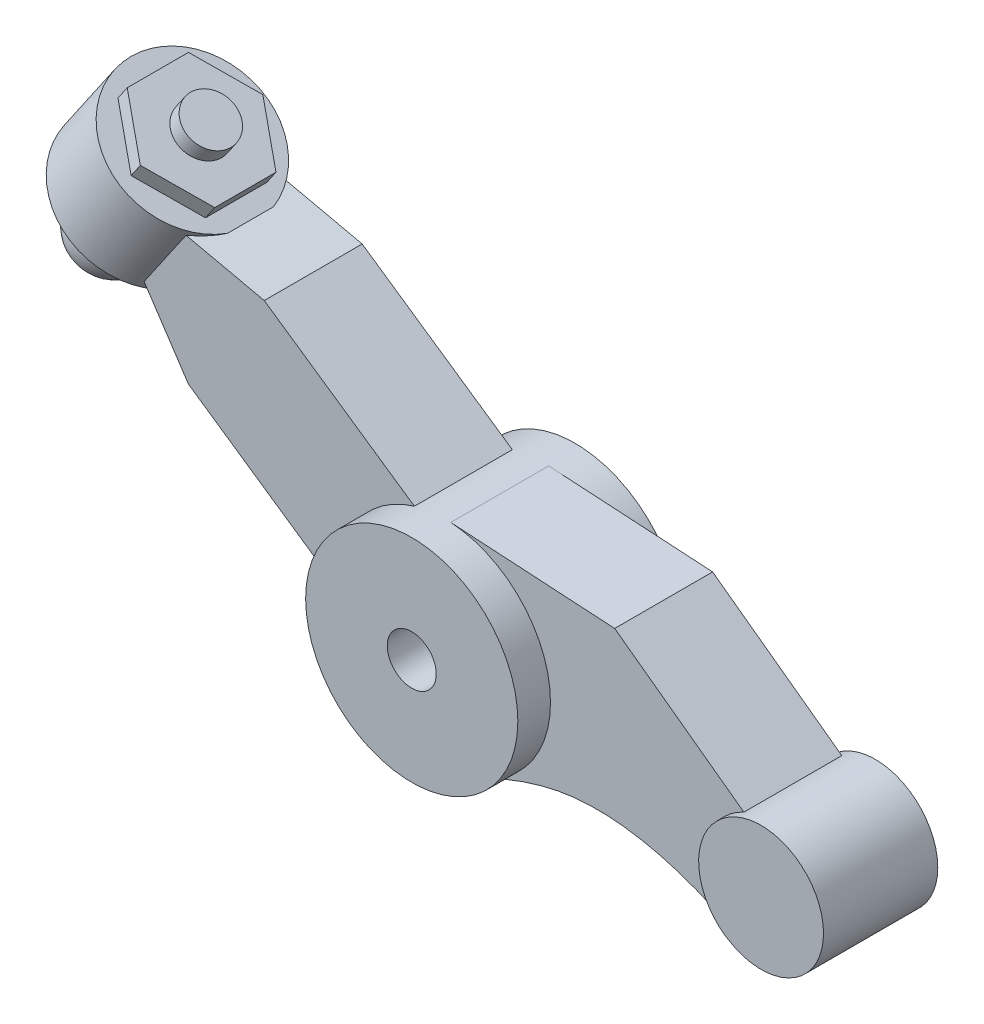
ISO-10303-21;
HEADER;
FILE_DESCRIPTION(('STEP AP214'),'2;1');
FILE_NAME('part.step','',(''),(''),'','','');
FILE_SCHEMA(('AUTOMOTIVE_DESIGN { 1 0 10303 214 1 1 1 1 }'));
ENDSEC;
DATA;
#1=APPLICATION_CONTEXT('core data for automotive mechanical design processes');
#2=APPLICATION_PROTOCOL_DEFINITION('international standard','automotive_design',2000,#1);
#3=PRODUCT_CONTEXT('',#1,'mechanical');
#4=PRODUCT('Part','Part','',(#3));
#5=PRODUCT_RELATED_PRODUCT_CATEGORY('part','',(#4));
#6=PRODUCT_DEFINITION_FORMATION('','',#4);
#7=PRODUCT_DEFINITION_CONTEXT('part definition',#1,'design');
#8=PRODUCT_DEFINITION('design','',#6,#7);
#9=PRODUCT_DEFINITION_SHAPE('','',#8);
#10=(LENGTH_UNIT() NAMED_UNIT(*) SI_UNIT(.MILLI.,.METRE.));
#11=(NAMED_UNIT(*) PLANE_ANGLE_UNIT() SI_UNIT($,.RADIAN.));
#12=(NAMED_UNIT(*) SI_UNIT($,.STERADIAN.) SOLID_ANGLE_UNIT());
#13=UNCERTAINTY_MEASURE_WITH_UNIT(LENGTH_MEASURE(1.E-05),#10,'distance_accuracy_value','');
#14=(GEOMETRIC_REPRESENTATION_CONTEXT(3) GLOBAL_UNCERTAINTY_ASSIGNED_CONTEXT((#13)) GLOBAL_UNIT_ASSIGNED_CONTEXT((#10,
#11,#12)) REPRESENTATION_CONTEXT('',''));
#15=CARTESIAN_POINT('',(0.,0.,0.));
#16=DIRECTION('',(0.,0.,1.));
#17=DIRECTION('',(1.,0.,0.));
#18=AXIS2_PLACEMENT_3D('',#15,#16,#17);
#19=CARTESIAN_POINT('',(3.97757068991306,-1.80597908772505,0.6));
#20=CARTESIAN_POINT('',(3.3360099674459,-1.42892137355787,0.6));
#21=CARTESIAN_POINT('',(2.18413130724052,-1.08683612083201,0.6));
#22=CARTESIAN_POINT('',(1.13775478577054,-1.478027448825,0.6));
#23=CARTESIAN_POINT('',(0.834921808302828,-1.61584534389586,0.6));
#24=CARTESIAN_POINT('',(0.826282358133006,-1.61959801900891,0.6));
#25=B_SPLINE_CURVE_WITH_KNOTS('',3,(#19,#20,#21,#22,#23,#24),.UNSPECIFIED.,.F.,.F.,(4,1,1,4),
(0.,0.696300419657063,0.991396998333315,1.),.UNSPECIFIED.);
#26=DIRECTION('',(0.,0.,-1.));
#27=VECTOR('',#26,1.);
#28=SURFACE_OF_LINEAR_EXTRUSION('',#25,#27);
#29=CARTESIAN_POINT('',(3.97757068991306,-1.80597908772505,-0.6));
#30=CARTESIAN_POINT('',(3.3360099674459,-1.42892137355787,-0.6));
#31=CARTESIAN_POINT('',(2.18413130724052,-1.08683612083201,-0.6));
#32=CARTESIAN_POINT('',(1.13775478577054,-1.478027448825,-0.6));
#33=CARTESIAN_POINT('',(0.834921808302828,-1.61584534389586,-0.6));
#34=CARTESIAN_POINT('',(0.826282358133006,-1.61959801900891,-0.6));
#35=B_SPLINE_CURVE_WITH_KNOTS('',3,(#29,#30,#31,#32,#33,#34),.UNSPECIFIED.,.F.,.F.,(4,1,1,4),
(0.,0.696300419657063,0.991396998333315,1.),.UNSPECIFIED.);
#36=CARTESIAN_POINT('',(3.85078788085251,-1.73445498969905,-0.6));
#37=VERTEX_POINT('',#36);
#38=CARTESIAN_POINT('',(0.826282358133006,-1.61959801900891,-0.6));
#39=VERTEX_POINT('',#38);
#40=EDGE_CURVE('E128',#37,#39,#35,.T.);
#41=ORIENTED_EDGE('',*,*,#40,.F.);
#42=DIRECTION('',(0.,0.,-1.));
#43=VECTOR('',#42,1.);
#44=CARTESIAN_POINT('',(3.85078788085251,-1.73445498969905,0.6));
#45=LINE('',#44,#43);
#46=CARTESIAN_POINT('',(3.85078788085251,-1.73445498969905,0.6));
#47=VERTEX_POINT('',#46);
#48=EDGE_CURVE('E12',#47,#37,#45,.T.);
#49=ORIENTED_EDGE('',*,*,#48,.F.);
#50=CARTESIAN_POINT('',(0.826282358133006,-1.61959801900891,0.6));
#51=VERTEX_POINT('',#50);
#52=EDGE_CURVE('E144',#47,#51,#25,.T.);
#53=ORIENTED_EDGE('',*,*,#52,.T.);
#54=DIRECTION('',(0.,0.,-1.));
#55=VECTOR('',#54,1.);
#56=CARTESIAN_POINT('',(0.826282358133006,-1.61959801900891,0.6));
#57=LINE('',#56,#55);
#58=EDGE_CURVE('E71',#51,#39,#57,.T.);
#59=ORIENTED_EDGE('',*,*,#58,.T.);
#60=EDGE_LOOP('',(#41,#49,#53,#59));
#61=FACE_BOUND('',#60,.T.);
#62=ADVANCED_FACE('F54',(#61),#28,.T.);
#63=CARTESIAN_POINT('',(4.28835718655287,-1.10695351343871,0.6));
#64=DIRECTION('',(0.,0.,-1.));
#65=DIRECTION('',(-1.,0.,0.));
#66=AXIS2_PLACEMENT_3D('',#63,#64,#65);
#67=CYLINDRICAL_SURFACE('',#66,0.765);
#68=CARTESIAN_POINT('',(4.28835718655287,-1.10695351343871,-0.6));
#69=DIRECTION('',(0.,0.,1.));
#70=DIRECTION('',(1.,0.,0.));
#71=AXIS2_PLACEMENT_3D('',#68,#69,#70);
#72=CIRCLE('',#71,0.765);
#73=CARTESIAN_POINT('',(3.97757068991306,-0.40792793915236,-0.6));
#74=VERTEX_POINT('',#73);
#75=EDGE_CURVE('E132',#74,#37,#72,.T.);
#76=ORIENTED_EDGE('',*,*,#75,.F.);
#77=DIRECTION('',(0.,0.,-1.));
#78=VECTOR('',#77,1.);
#79=CARTESIAN_POINT('',(3.97757068991306,-0.40792793915236,0.6));
#80=LINE('',#79,#78);
#81=CARTESIAN_POINT('',(3.97757068991306,-0.40792793915236,0.6));
#82=VERTEX_POINT('',#81);
#83=EDGE_CURVE('E63',#82,#74,#80,.T.);
#84=ORIENTED_EDGE('',*,*,#83,.F.);
#85=CARTESIAN_POINT('',(4.28835718655287,-1.10695351343871,0.6));
#86=DIRECTION('',(0.,0.,1.));
#87=DIRECTION('',(1.,0.,0.));
#88=AXIS2_PLACEMENT_3D('',#85,#86,#87);
#89=CIRCLE('',#88,0.765);
#90=EDGE_CURVE('E111',#82,#47,#89,.T.);
#91=ORIENTED_EDGE('',*,*,#90,.T.);
#92=ORIENTED_EDGE('',*,*,#48,.T.);
#93=EDGE_LOOP('',(#76,#84,#91,#92));
#94=FACE_BOUND('',#93,.T.);
#95=ADVANCED_FACE('F150',(#94),#67,.F.);
#96=CARTESIAN_POINT('',(1.19203166574045,1.62962595836703,0.6));
#97=DIRECTION('',(-0.590388192658637,-0.807119434761218,0.));
#98=DIRECTION('',(0.807119434761219,-0.590388192658637,0.));
#99=AXIS2_PLACEMENT_3D('',#96,#97,#98);
#100=PLANE('',#99);
#101=DIRECTION('',(-0.807119434761218,0.590388192658637,0.));
#102=VECTOR('',#101,1.);
#103=CARTESIAN_POINT('',(1.19203166574045,1.62962595836703,-0.6));
#104=LINE('',#103,#102);
#105=CARTESIAN_POINT('',(2.3946417351562,0.749946006705987,-0.6));
#106=VERTEX_POINT('',#105);
#107=EDGE_CURVE('E118',#74,#106,#104,.T.);
#108=ORIENTED_EDGE('',*,*,#107,.T.);
#109=DIRECTION('',(0.,0.,-1.));
#110=VECTOR('',#109,1.);
#111=CARTESIAN_POINT('',(2.3946417351562,0.749946006705987,0.6));
#112=LINE('',#111,#110);
#113=CARTESIAN_POINT('',(2.3946417351562,0.749946006705987,0.6));
#114=VERTEX_POINT('',#113);
#115=EDGE_CURVE('E115',#114,#106,#112,.T.);
#116=ORIENTED_EDGE('',*,*,#115,.F.);
#117=DIRECTION('',(-0.807119434761218,0.590388192658637,0.));
#118=VECTOR('',#117,1.);
#119=CARTESIAN_POINT('',(1.19203166574045,1.62962595836703,0.6));
#120=LINE('',#119,#118);
#121=EDGE_CURVE('E104',#82,#114,#120,.T.);
#122=ORIENTED_EDGE('',*,*,#121,.F.);
#123=ORIENTED_EDGE('',*,*,#83,.T.);
#124=EDGE_LOOP('',(#108,#116,#122,#123));
#125=FACE_BOUND('',#124,.T.);
#126=ADVANCED_FACE('F116',(#125),#100,.F.);
#127=CARTESIAN_POINT('',(0.053419954267125,0.890407493572512,0.6));
#128=DIRECTION('',(-0.0598872692257837,-0.998205146743232,0.));
#129=DIRECTION('',(0.998205146743233,-0.0598872692257837,0.));
#130=AXIS2_PLACEMENT_3D('',#127,#128,#129);
#131=PLANE('',#130);
#132=DIRECTION('',(-0.998205146743233,0.0598872692257837,0.));
#133=VECTOR('',#132,1.);
#134=CARTESIAN_POINT('',(0.053419954267125,0.890407493572512,-0.6));
#135=LINE('',#134,#133);
#136=CARTESIAN_POINT('',(0.386210636546387,0.870441732776233,-0.6));
#137=VERTEX_POINT('',#136);
#138=EDGE_CURVE('E139',#106,#137,#135,.T.);
#139=ORIENTED_EDGE('',*,*,#138,.T.);
#140=DIRECTION('',(0.,0.,-1.));
#141=VECTOR('',#140,1.);
#142=CARTESIAN_POINT('',(0.386210636546387,0.870441732776233,0.6));
#143=LINE('',#142,#141);
#144=CARTESIAN_POINT('',(0.386210636546387,0.870441732776233,0.6));
#145=VERTEX_POINT('',#144);
#146=EDGE_CURVE('E88',#145,#137,#143,.T.);
#147=ORIENTED_EDGE('',*,*,#146,.F.);
#148=DIRECTION('',(-0.998205146743233,0.0598872692257837,0.));
#149=VECTOR('',#148,1.);
#150=CARTESIAN_POINT('',(0.053419954267125,0.890407493572512,0.6));
#151=LINE('',#150,#149);
#152=EDGE_CURVE('E109',#114,#145,#151,.T.);
#153=ORIENTED_EDGE('',*,*,#152,.F.);
#154=ORIENTED_EDGE('',*,*,#115,.T.);
#155=EDGE_LOOP('',(#139,#147,#153,#154));
#156=FACE_BOUND('',#155,.T.);
#157=ADVANCED_FACE('F122',(#156),#131,.F.);
#158=CARTESIAN_POINT('',(0.308357186552869,-0.427224957989969,0.6));
#159=DIRECTION('',(0.,0.,-1.));
#160=DIRECTION('',(-1.,0.,0.));
#161=AXIS2_PLACEMENT_3D('',#158,#159,#160);
#162=CYLINDRICAL_SURFACE('',#161,1.3);
#163=CARTESIAN_POINT('',(0.308357186552869,-0.427224957989969,-0.6));
#164=DIRECTION('',(0.,0.,1.));
#165=DIRECTION('',(1.,0.,0.));
#166=AXIS2_PLACEMENT_3D('',#163,#164,#165);
#167=CIRCLE('',#166,1.3);
#168=EDGE_CURVE('E141',#39,#137,#167,.T.);
#169=ORIENTED_EDGE('',*,*,#168,.F.);
#170=ORIENTED_EDGE('',*,*,#58,.F.);
#171=CARTESIAN_POINT('',(0.308357186552869,-0.427224957989969,0.6));
#172=DIRECTION('',(0.,0.,1.));
#173=DIRECTION('',(1.,0.,0.));
#174=AXIS2_PLACEMENT_3D('',#171,#172,#173);
#175=CIRCLE('',#174,1.3);
#176=EDGE_CURVE('E123',#51,#145,#175,.T.);
#177=ORIENTED_EDGE('',*,*,#176,.T.);
#178=ORIENTED_EDGE('',*,*,#146,.T.);
#179=EDGE_LOOP('',(#169,#170,#177,#178));
#180=FACE_BOUND('',#179,.T.);
#181=ADVANCED_FACE('F151',(#180),#162,.F.);
#182=CARTESIAN_POINT('',(0.,0.,0.6));
#183=DIRECTION('',(0.,0.,1.));
#184=DIRECTION('',(1.,0.,0.));
#185=AXIS2_PLACEMENT_3D('',#182,#183,#184);
#186=PLANE('',#185);
#187=ORIENTED_EDGE('',*,*,#52,.F.);
#188=ORIENTED_EDGE('',*,*,#90,.F.);
#189=ORIENTED_EDGE('',*,*,#121,.T.);
#190=ORIENTED_EDGE('',*,*,#152,.T.);
#191=ORIENTED_EDGE('',*,*,#176,.F.);
#192=EDGE_LOOP('',(#187,#188,#189,#190,#191));
#193=FACE_BOUND('',#192,.T.);
#194=ADVANCED_FACE('F106',(#193),#186,.T.);
#195=CARTESIAN_POINT('',(0.,0.,-0.6));
#196=DIRECTION('',(0.,0.,1.));
#197=DIRECTION('',(1.,0.,0.));
#198=AXIS2_PLACEMENT_3D('',#195,#196,#197);
#199=PLANE('',#198);
#200=ORIENTED_EDGE('',*,*,#40,.T.);
#201=ORIENTED_EDGE('',*,*,#168,.T.);
#202=ORIENTED_EDGE('',*,*,#138,.F.);
#203=ORIENTED_EDGE('',*,*,#107,.F.);
#204=ORIENTED_EDGE('',*,*,#75,.T.);
#205=EDGE_LOOP('',(#200,#201,#202,#203,#204));
#206=FACE_BOUND('',#205,.T.);
#207=ADVANCED_FACE('F149',(#206),#199,.F.);
#208=CLOSED_SHELL('',(#62,#95,#126,#157,#181,#194,#207));
#209=MANIFOLD_SOLID_BREP('B2',#208);
#210=CARTESIAN_POINT('',(3.97757068991306,-1.80597908772505,0.7));
#211=CARTESIAN_POINT('',(3.3360099674459,-1.42892137355787,0.7));
#212=CARTESIAN_POINT('',(2.18413130724052,-1.08683612083201,0.7));
#213=CARTESIAN_POINT('',(1.13775478577054,-1.478027448825,0.7));
#214=CARTESIAN_POINT('',(0.834921808302828,-1.61584534389586,0.7));
#215=CARTESIAN_POINT('',(0.826282358133006,-1.61959801900891,0.7));
#216=B_SPLINE_CURVE_WITH_KNOTS('',3,(#210,#211,#212,#213,#214,#215),.UNSPECIFIED.,.F.,.F.,(4,1,
1,4),(0.,0.696300419657063,0.991396998333315,1.),.UNSPECIFIED.);
#217=DIRECTION('',(0.,0.,-1.));
#218=VECTOR('',#217,1.);
#219=SURFACE_OF_LINEAR_EXTRUSION('',#216,#218);
#220=CARTESIAN_POINT('',(3.97757068991306,-1.80597908772505,-0.7));
#221=CARTESIAN_POINT('',(3.3360099674459,-1.42892137355787,-0.7));
#222=CARTESIAN_POINT('',(2.18413130724052,-1.08683612083201,-0.7));
#223=CARTESIAN_POINT('',(1.13775478577054,-1.478027448825,-0.7));
#224=CARTESIAN_POINT('',(0.834921808302828,-1.61584534389586,-0.7));
#225=CARTESIAN_POINT('',(0.826282358133006,-1.61959801900891,-0.7));
#226=B_SPLINE_CURVE_WITH_KNOTS('',3,(#220,#221,#222,#223,#224,#225),.UNSPECIFIED.,.F.,.F.,(4,1,
1,4),(0.,0.696300419657063,0.991396998333315,1.),.UNSPECIFIED.);
#227=CARTESIAN_POINT('',(3.97757068991306,-1.80597908772505,-0.7));
#228=VERTEX_POINT('',#227);
#229=CARTESIAN_POINT('',(3.85078788085251,-1.73445498969905,-0.7));
#230=VERTEX_POINT('',#229);
#231=EDGE_CURVE('E253',#228,#230,#226,.T.);
#232=ORIENTED_EDGE('',*,*,#231,.F.);
#233=DIRECTION('',(0.,0.,-1.));
#234=VECTOR('',#233,1.);
#235=CARTESIAN_POINT('',(3.97757068991306,-1.80597908772505,0.7));
#236=LINE('',#235,#234);
#237=CARTESIAN_POINT('',(3.97757068991306,-1.80597908772505,0.7));
#238=VERTEX_POINT('',#237);
#239=EDGE_CURVE('E52',#238,#228,#236,.T.);
#240=ORIENTED_EDGE('',*,*,#239,.F.);
#241=CARTESIAN_POINT('',(3.85078788085251,-1.73445498969905,0.7));
#242=VERTEX_POINT('',#241);
#243=EDGE_CURVE('E254',#238,#242,#216,.T.);
#244=ORIENTED_EDGE('',*,*,#243,.T.);
#245=DIRECTION('',(0.,0.,-1.));
#246=VECTOR('',#245,1.);
#247=CARTESIAN_POINT('',(3.85078788085251,-1.73445498969905,0.7));
#248=LINE('',#247,#246);
#249=EDGE_CURVE('E233',#242,#230,#248,.T.);
#250=ORIENTED_EDGE('',*,*,#249,.T.);
#251=EDGE_LOOP('',(#232,#240,#244,#250));
#252=FACE_BOUND('',#251,.T.);
#253=ADVANCED_FACE('F224',(#252),#219,.T.);
#254=CARTESIAN_POINT('',(4.28835718655287,-1.10695351343871,0.7));
#255=DIRECTION('',(0.,0.,-1.));
#256=DIRECTION('',(-1.,0.,0.));
#257=AXIS2_PLACEMENT_3D('',#254,#255,#256);
#258=CYLINDRICAL_SURFACE('',#257,0.765);
#259=CARTESIAN_POINT('',(4.28835718655287,-1.10695351343871,-0.7));
#260=DIRECTION('',(0.,0.,1.));
#261=DIRECTION('',(1.,0.,0.));
#262=AXIS2_PLACEMENT_3D('',#259,#260,#261);
#263=CIRCLE('',#262,0.765);
#264=EDGE_CURVE('E255',#228,#230,#263,.T.);
#265=ORIENTED_EDGE('',*,*,#264,.T.);
#266=ORIENTED_EDGE('',*,*,#249,.F.);
#267=CARTESIAN_POINT('',(4.28835718655287,-1.10695351343871,0.7));
#268=DIRECTION('',(0.,0.,1.));
#269=DIRECTION('',(1.,0.,0.));
#270=AXIS2_PLACEMENT_3D('',#267,#268,#269);
#271=CIRCLE('',#270,0.765);
#272=EDGE_CURVE('E240',#238,#242,#271,.T.);
#273=ORIENTED_EDGE('',*,*,#272,.F.);
#274=ORIENTED_EDGE('',*,*,#239,.T.);
#275=EDGE_LOOP('',(#265,#266,#273,#274));
#276=FACE_BOUND('',#275,.T.);
#277=ADVANCED_FACE('F256',(#276),#258,.T.);
#278=CARTESIAN_POINT('',(0.,0.,0.7));
#279=DIRECTION('',(0.,0.,1.));
#280=DIRECTION('',(1.,0.,0.));
#281=AXIS2_PLACEMENT_3D('',#278,#279,#280);
#282=PLANE('',#281);
#283=ORIENTED_EDGE('',*,*,#243,.F.);
#284=ORIENTED_EDGE('',*,*,#272,.T.);
#285=EDGE_LOOP('',(#283,#284));
#286=FACE_BOUND('',#285,.T.);
#287=ADVANCED_FACE('F274',(#286),#282,.T.);
#288=CARTESIAN_POINT('',(0.,0.,-0.7));
#289=DIRECTION('',(0.,0.,1.));
#290=DIRECTION('',(1.,0.,0.));
#291=AXIS2_PLACEMENT_3D('',#288,#289,#290);
#292=PLANE('',#291);
#293=ORIENTED_EDGE('',*,*,#231,.T.);
#294=ORIENTED_EDGE('',*,*,#264,.F.);
#295=EDGE_LOOP('',(#293,#294));
#296=FACE_BOUND('',#295,.T.);
#297=ADVANCED_FACE('F259',(#296),#292,.F.);
#298=CLOSED_SHELL('',(#253,#277,#287,#297));
#299=MANIFOLD_SOLID_BREP('B6',#298);
#300=CARTESIAN_POINT('',(-4.12985637301049,3.25851652353779,0.));
#301=DIRECTION('',(0.565974647839502,0.824422645251179,0.));
#302=DIRECTION('',(-0.824422645251179,0.565974647839502,0.));
#303=AXIS2_PLACEMENT_3D('',#300,#301,#302);
#304=PLANE('',#303);
#305=CARTESIAN_POINT('',(-3.37963176583192,2.74347959400384,0.));
#306=DIRECTION('',(0.565974647839502,0.824422645251179,0.));
#307=DIRECTION('',(-0.824422645251179,0.565974647839502,0.));
#308=AXIS2_PLACEMENT_3D('',#305,#306,#307);
#309=CIRCLE('',#308,0.91);
#310=CARTESIAN_POINT('',(-2.66615880410291,2.25367304807308,-0.28132877642538));
#311=VERTEX_POINT('',#310);
#312=CARTESIAN_POINT('',(-2.66615880410291,2.25367304807308,0.28132877642538));
#313=VERTEX_POINT('',#312);
#314=EDGE_CURVE('E445',#311,#313,#309,.T.);
#315=ORIENTED_EDGE('',*,*,#314,.T.);
#316=DIRECTION('',(0.,0.,-1.));
#317=VECTOR('',#316,1.);
#318=CARTESIAN_POINT('',(-2.66615880410291,2.25367304807308,0.6));
#319=LINE('',#318,#317);
#320=EDGE_CURVE('E528',#313,#311,#319,.T.);
#321=ORIENTED_EDGE('',*,*,#320,.T.);
#322=EDGE_LOOP('',(#315,#321));
#323=FACE_BOUND('',#322,.T.);
#324=DIRECTION('',(0.,0.,1.));
#325=VECTOR('',#324,1.);
#326=CARTESIAN_POINT('',(-2.84375704641865,2.37559607290817,0.));
#327=LINE('',#326,#325);
#328=CARTESIAN_POINT('',(-2.84375704641865,2.37559607290817,-0.375277674973256));
#329=VERTEX_POINT('',#328);
#330=CARTESIAN_POINT('',(-2.84375704641865,2.37559607290817,0.375277674973257));
#331=VERTEX_POINT('',#330);
#332=EDGE_CURVE('E317',#329,#331,#327,.T.);
#333=ORIENTED_EDGE('',*,*,#332,.T.);
#334=DIRECTION('',(-0.713970954242688,0.49014842292696,0.5));
#335=VECTOR('',#334,1.);
#336=CARTESIAN_POINT('',(-3.67436286150922,2.94581553060646,0.956958071181804));
#337=LINE('',#336,#335);
#338=CARTESIAN_POINT('',(-3.37963176583192,2.74347959400384,0.750555349946513));
#339=VERTEX_POINT('',#338);
#340=EDGE_CURVE('E222',#331,#339,#337,.T.);
#341=ORIENTED_EDGE('',*,*,#340,.T.);
#342=DIRECTION('',(-0.713970954242688,0.49014842292696,-0.5));
#343=VECTOR('',#342,1.);
#344=CARTESIAN_POINT('',(-4.21023758092248,3.31369905170214,0.168874953737966));
#345=LINE('',#344,#343);
#346=CARTESIAN_POINT('',(-3.91550648524519,3.11136311509952,0.375277674973257));
#347=VERTEX_POINT('',#346);
#348=EDGE_CURVE('E531',#339,#347,#345,.T.);
#349=ORIENTED_EDGE('',*,*,#348,.T.);
#350=DIRECTION('',(0.,0.,-1.));
#351=VECTOR('',#350,1.);
#352=CARTESIAN_POINT('',(-3.91550648524519,3.11136311509952,0.));
#353=LINE('',#352,#351);
#354=CARTESIAN_POINT('',(-3.91550648524519,3.11136311509952,-0.375277674973257));
#355=VERTEX_POINT('',#354);
#356=EDGE_CURVE('E538',#347,#355,#353,.T.);
#357=ORIENTED_EDGE('',*,*,#356,.T.);
#358=DIRECTION('',(0.713970954242688,-0.49014842292696,-0.5));
#359=VECTOR('',#358,1.);
#360=CARTESIAN_POINT('',(-4.21023758092248,3.31369905170214,-0.168874953737966));
#361=LINE('',#360,#359);
#362=CARTESIAN_POINT('',(-3.37963176583192,2.74347959400384,-0.750555349946513));
#363=VERTEX_POINT('',#362);
#364=EDGE_CURVE('E542',#355,#363,#361,.T.);
#365=ORIENTED_EDGE('',*,*,#364,.T.);
#366=DIRECTION('',(0.713970954242688,-0.49014842292696,0.5));
#367=VECTOR('',#366,1.);
#368=CARTESIAN_POINT('',(-3.67436286150922,2.94581553060646,-0.956958071181804));
#369=LINE('',#368,#367);
#370=EDGE_CURVE('E546',#363,#329,#369,.T.);
#371=ORIENTED_EDGE('',*,*,#370,.T.);
#372=EDGE_LOOP('',(#333,#341,#349,#357,#365,#371));
#373=FACE_BOUND('',#372,.T.);
#374=ADVANCED_FACE('F307',(#323,#373),#304,.T.);
#375=CARTESIAN_POINT('',(0.308357186552869,-0.427224957989969,1.));
#376=DIRECTION('',(0.,0.,-1.));
#377=DIRECTION('',(-1.,0.,0.));
#378=AXIS2_PLACEMENT_3D('',#375,#376,#377);
#379=CYLINDRICAL_SURFACE('',#378,1.3);
#380=DIRECTION('',(0.,0.,-1.));
#381=VECTOR('',#380,1.);
#382=CARTESIAN_POINT('',(-0.0591895229613273,0.819735112070532,0.6));
#383=LINE('',#382,#381);
#384=CARTESIAN_POINT('',(-0.0591895229613259,0.819735112070531,0.6));
#385=VERTEX_POINT('',#384);
#386=CARTESIAN_POINT('',(-0.0591895229613269,0.819735112070531,-0.6));
#387=VERTEX_POINT('',#386);
#388=EDGE_CURVE('E505',#385,#387,#383,.T.);
#389=ORIENTED_EDGE('',*,*,#388,.F.);
#390=CARTESIAN_POINT('',(0.308357186552869,-0.427224957989969,0.6));
#391=DIRECTION('',(0.,0.,1.));
#392=DIRECTION('',(1.,0.,0.));
#393=AXIS2_PLACEMENT_3D('',#390,#391,#392);
#394=CIRCLE('',#393,1.3);
#395=CARTESIAN_POINT('',(-0.98738794541812,-0.532318026141413,0.6));
#396=VERTEX_POINT('',#395);
#397=EDGE_CURVE('E459',#385,#396,#394,.T.);
#398=ORIENTED_EDGE('',*,*,#397,.T.);
#399=DIRECTION('',(0.,0.,-1.));
#400=VECTOR('',#399,1.);
#401=CARTESIAN_POINT('',(-0.987387945418122,-0.532318026141412,0.6));
#402=LINE('',#401,#400);
#403=CARTESIAN_POINT('',(-0.987387945418122,-0.532318026141412,-0.6));
#404=VERTEX_POINT('',#403);
#405=EDGE_CURVE('E477',#396,#404,#402,.T.);
#406=ORIENTED_EDGE('',*,*,#405,.T.);
#407=CARTESIAN_POINT('',(0.308357186552869,-0.427224957989969,-0.6));
#408=DIRECTION('',(0.,0.,1.));
#409=DIRECTION('',(1.,0.,0.));
#410=AXIS2_PLACEMENT_3D('',#407,#408,#409);
#411=CIRCLE('',#410,1.3);
#412=EDGE_CURVE('E478',#387,#404,#411,.T.);
#413=ORIENTED_EDGE('',*,*,#412,.F.);
#414=EDGE_LOOP('',(#389,#398,#406,#413));
#415=FACE_BOUND('',#414,.T.);
#416=CARTESIAN_POINT('',(0.308357186552869,-0.427224957989969,1.));
#417=DIRECTION('',(0.,0.,1.));
#418=DIRECTION('',(1.,0.,0.));
#419=AXIS2_PLACEMENT_3D('',#416,#417,#418);
#420=CIRCLE('',#419,1.3);
#421=CARTESIAN_POINT('',(1.60835718655287,-0.427224957989969,1.));
#422=VERTEX_POINT('',#421);
#423=EDGE_CURVE('E510',#422,#422,#420,.T.);
#424=ORIENTED_EDGE('',*,*,#423,.F.);
#425=EDGE_LOOP('',(#424));
#426=FACE_BOUND('',#425,.T.);
#427=CARTESIAN_POINT('',(0.308357186552869,-0.427224957989969,-1.));
#428=DIRECTION('',(0.,0.,1.));
#429=DIRECTION('',(1.,0.,0.));
#430=AXIS2_PLACEMENT_3D('',#427,#428,#429);
#431=CIRCLE('',#430,1.3);
#432=CARTESIAN_POINT('',(1.60835718655287,-0.427224957989969,-1.));
#433=VERTEX_POINT('',#432);
#434=EDGE_CURVE('E509',#433,#433,#431,.T.);
#435=ORIENTED_EDGE('',*,*,#434,.T.);
#436=EDGE_LOOP('',(#435));
#437=FACE_BOUND('',#436,.T.);
#438=ADVANCED_FACE('F309',(#415,#426,#437),#379,.T.);
#439=CARTESIAN_POINT('',(0.308357186552869,-0.427224957989969,1.));
#440=DIRECTION('',(0.,0.,-1.));
#441=DIRECTION('',(-1.,0.,0.));
#442=AXIS2_PLACEMENT_3D('',#439,#440,#441);
#443=CYLINDRICAL_SURFACE('',#442,0.3);
#444=CARTESIAN_POINT('',(0.308357186552869,-0.427224957989969,1.));
#445=DIRECTION('',(0.,0.,1.));
#446=DIRECTION('',(1.,0.,0.));
#447=AXIS2_PLACEMENT_3D('',#444,#445,#446);
#448=CIRCLE('',#447,0.3);
#449=CARTESIAN_POINT('',(0.608357186552869,-0.427224957989969,1.));
#450=VERTEX_POINT('',#449);
#451=EDGE_CURVE('E514',#450,#450,#448,.T.);
#452=ORIENTED_EDGE('',*,*,#451,.T.);
#453=EDGE_LOOP('',(#452));
#454=FACE_BOUND('',#453,.T.);
#455=CARTESIAN_POINT('',(0.308357186552869,-0.427224957989969,-1.));
#456=DIRECTION('',(0.,0.,1.));
#457=DIRECTION('',(1.,0.,0.));
#458=AXIS2_PLACEMENT_3D('',#455,#456,#457);
#459=CIRCLE('',#458,0.3);
#460=CARTESIAN_POINT('',(0.608357186552869,-0.427224957989969,-1.));
#461=VERTEX_POINT('',#460);
#462=EDGE_CURVE('E515',#461,#461,#459,.T.);
#463=ORIENTED_EDGE('',*,*,#462,.F.);
#464=EDGE_LOOP('',(#463));
#465=FACE_BOUND('',#464,.T.);
#466=ADVANCED_FACE('F600',(#454,#465),#443,.F.);
#467=CARTESIAN_POINT('',(0.,0.,1.));
#468=DIRECTION('',(0.,0.,1.));
#469=DIRECTION('',(1.,0.,0.));
#470=AXIS2_PLACEMENT_3D('',#467,#468,#469);
#471=PLANE('',#470);
#472=ORIENTED_EDGE('',*,*,#423,.T.);
#473=EDGE_LOOP('',(#472));
#474=FACE_BOUND('',#473,.T.);
#475=ORIENTED_EDGE('',*,*,#451,.F.);
#476=EDGE_LOOP('',(#475));
#477=FACE_BOUND('',#476,.T.);
#478=ADVANCED_FACE('F635',(#474,#477),#471,.T.);
#479=CARTESIAN_POINT('',(0.,0.,-1.));
#480=DIRECTION('',(0.,0.,1.));
#481=DIRECTION('',(1.,0.,0.));
#482=AXIS2_PLACEMENT_3D('',#479,#480,#481);
#483=PLANE('',#482);
#484=ORIENTED_EDGE('',*,*,#434,.F.);
#485=EDGE_LOOP('',(#484));
#486=FACE_BOUND('',#485,.T.);
#487=ORIENTED_EDGE('',*,*,#462,.T.);
#488=EDGE_LOOP('',(#487));
#489=FACE_BOUND('',#488,.T.);
#490=ADVANCED_FACE('F633',(#486,#489),#483,.F.);
#491=CARTESIAN_POINT('',(0.363530281861748,0.52953360675328,0.6));
#492=DIRECTION('',(0.565974647839502,0.824422645251179,0.));
#493=DIRECTION('',(-0.824422645251179,0.565974647839502,0.));
#494=AXIS2_PLACEMENT_3D('',#491,#492,#493);
#495=PLANE('',#494);
#496=DIRECTION('',(0.824422645251179,-0.565974647839502,0.));
#497=VECTOR('',#496,1.);
#498=CARTESIAN_POINT('',(0.363530281861748,0.52953360675328,-0.6));
#499=LINE('',#498,#497);
#500=CARTESIAN_POINT('',(-1.89890200514003,2.08271670315697,-0.6));
#501=VERTEX_POINT('',#500);
#502=EDGE_CURVE('E482',#501,#387,#499,.T.);
#503=ORIENTED_EDGE('',*,*,#502,.F.);
#504=DIRECTION('',(0.,0.,-1.));
#505=VECTOR('',#504,1.);
#506=CARTESIAN_POINT('',(-1.89890200514003,2.08271670315697,0.6));
#507=LINE('',#506,#505);
#508=CARTESIAN_POINT('',(-1.89890200514003,2.08271670315697,0.6));
#509=VERTEX_POINT('',#508);
#510=EDGE_CURVE('E501',#509,#501,#507,.T.);
#511=ORIENTED_EDGE('',*,*,#510,.F.);
#512=DIRECTION('',(0.824422645251179,-0.565974647839502,0.));
#513=VECTOR('',#512,1.);
#514=CARTESIAN_POINT('',(0.363530281861748,0.52953360675328,0.6));
#515=LINE('',#514,#513);
#516=EDGE_CURVE('E462',#509,#385,#515,.T.);
#517=ORIENTED_EDGE('',*,*,#516,.T.);
#518=ORIENTED_EDGE('',*,*,#388,.T.);
#519=EDGE_LOOP('',(#503,#511,#517,#518));
#520=FACE_BOUND('',#519,.T.);
#521=ADVANCED_FACE('F629',(#520),#495,.T.);
#522=CARTESIAN_POINT('',(0.352296377100373,1.5811158732535,0.6));
#523=DIRECTION('',(0.217481810521195,0.976064373948984,0.));
#524=DIRECTION('',(-0.976064373948985,0.217481810521195,0.));
#525=AXIS2_PLACEMENT_3D('',#522,#523,#524);
#526=PLANE('',#525);
#527=CARTESIAN_POINT('',(-3.57662041891397,2.45653757799957,0.));
#528=DIRECTION('',(0.217481810521195,0.976064373948984,0.));
#529=DIRECTION('',(0.976064373948985,-0.217481810521195,0.));
#530=AXIS2_PLACEMENT_3D('',#527,#528,#529);
#531=ELLIPSE('',#530,0.980837280488426,0.909999999999999);
#532=CARTESIAN_POINT('',(-2.85683448697628,2.29615845563476,-0.6));
#533=VERTEX_POINT('',#532);
#534=EDGE_CURVE('E332',#311,#533,#531,.T.);
#535=ORIENTED_EDGE('',*,*,#534,.F.);
#536=ORIENTED_EDGE('',*,*,#320,.F.);
#537=CARTESIAN_POINT('',(-2.85683448697628,2.29615845563476,0.6));
#538=VERTEX_POINT('',#537);
#539=EDGE_CURVE('E456',#538,#313,#531,.T.);
#540=ORIENTED_EDGE('',*,*,#539,.F.);
#541=DIRECTION('',(0.976064373948985,-0.217481810521195,0.));
#542=VECTOR('',#541,1.);
#543=CARTESIAN_POINT('',(0.352296377100373,1.5811158732535,0.6));
#544=LINE('',#543,#542);
#545=EDGE_CURVE('E467',#538,#509,#544,.T.);
#546=ORIENTED_EDGE('',*,*,#545,.T.);
#547=ORIENTED_EDGE('',*,*,#510,.T.);
#548=DIRECTION('',(0.976064373948985,-0.217481810521195,0.));
#549=VECTOR('',#548,1.);
#550=CARTESIAN_POINT('',(0.352296377100373,1.5811158732535,-0.6));
#551=LINE('',#550,#549);
#552=EDGE_CURVE('E486',#533,#501,#551,.T.);
#553=ORIENTED_EDGE('',*,*,#552,.F.);
#554=EDGE_LOOP('',(#535,#536,#540,#546,#547,#553));
#555=FACE_BOUND('',#554,.T.);
#556=ADVANCED_FACE('F625',(#555),#526,.T.);
#557=CARTESIAN_POINT('',(-1.6234693887964,-1.07949535534786,0.6));
#558=DIRECTION('',(0.832716708192277,0.553699272075933,0.));
#559=DIRECTION('',(-0.553699272075933,0.832716708192277,0.));
#560=AXIS2_PLACEMENT_3D('',#557,#558,#559);
#561=PLANE('',#560);
#562=DIRECTION('',(0.553699272075933,-0.832716708192277,0.));
#563=VECTOR('',#562,1.);
#564=CARTESIAN_POINT('',(-1.6234693887964,-1.07949535534786,0.6));
#565=LINE('',#564,#563);
#566=CARTESIAN_POINT('',(-3.37051388683895,1.54791128367678,0.6));
#567=VERTEX_POINT('',#566);
#568=CARTESIAN_POINT('',(-2.82710042759682,0.730663564945039,0.6));
#569=VERTEX_POINT('',#568);
#570=EDGE_CURVE('E470',#567,#569,#565,.T.);
#571=ORIENTED_EDGE('',*,*,#570,.F.);
#572=CARTESIAN_POINT('',(-3.77883218755917,2.16198735062849,0.));
#573=DIRECTION('',(0.832716708192277,0.553699272075933,0.));
#574=DIRECTION('',(-0.553699272075933,0.832716708192277,0.));
#575=AXIS2_PLACEMENT_3D('',#572,#573,#574);
#576=ELLIPSE('',#575,0.980837280488429,0.909999999999999);
#577=CARTESIAN_POINT('',(-3.37051388683895,1.54791128367678,-0.6));
#578=VERTEX_POINT('',#577);
#579=EDGE_CURVE('E449',#567,#578,#576,.T.);
#580=ORIENTED_EDGE('',*,*,#579,.T.);
#581=DIRECTION('',(0.553699272075933,-0.832716708192277,0.));
#582=VECTOR('',#581,1.);
#583=CARTESIAN_POINT('',(-1.6234693887964,-1.07949535534786,-0.6));
#584=LINE('',#583,#582);
#585=CARTESIAN_POINT('',(-2.82710042759682,0.730663564945039,-0.6));
#586=VERTEX_POINT('',#585);
#587=EDGE_CURVE('E489',#578,#586,#584,.T.);
#588=ORIENTED_EDGE('',*,*,#587,.T.);
#589=DIRECTION('',(0.,0.,-1.));
#590=VECTOR('',#589,1.);
#591=CARTESIAN_POINT('',(-2.82710042759682,0.730663564945039,0.6));
#592=LINE('',#591,#590);
#593=EDGE_CURVE('E497',#569,#586,#592,.T.);
#594=ORIENTED_EDGE('',*,*,#593,.F.);
#595=EDGE_LOOP('',(#571,#580,#588,#594));
#596=FACE_BOUND('',#595,.T.);
#597=ADVANCED_FACE('F621',(#596),#561,.F.);
#598=CARTESIAN_POINT('',(-0.564668140595049,-0.822519531458665,0.6));
#599=DIRECTION('',(0.565974647839506,0.824422645251176,0.));
#600=DIRECTION('',(-0.824422645251176,0.565974647839506,0.));
#601=AXIS2_PLACEMENT_3D('',#598,#599,#600);
#602=PLANE('',#601);
#603=DIRECTION('',(0.824422645251176,-0.565974647839506,0.));
#604=VECTOR('',#603,1.);
#605=CARTESIAN_POINT('',(-0.564668140595049,-0.822519531458665,-0.6));
#606=LINE('',#605,#604);
#607=EDGE_CURVE('E463',#586,#404,#606,.T.);
#608=ORIENTED_EDGE('',*,*,#607,.T.);
#609=ORIENTED_EDGE('',*,*,#405,.F.);
#610=DIRECTION('',(0.824422645251176,-0.565974647839506,0.));
#611=VECTOR('',#610,1.);
#612=CARTESIAN_POINT('',(-0.564668140595049,-0.822519531458665,0.6));
#613=LINE('',#612,#611);
#614=EDGE_CURVE('E473',#569,#396,#613,.T.);
#615=ORIENTED_EDGE('',*,*,#614,.F.);
#616=ORIENTED_EDGE('',*,*,#593,.T.);
#617=EDGE_LOOP('',(#608,#609,#615,#616));
#618=FACE_BOUND('',#617,.T.);
#619=ADVANCED_FACE('F614',(#618),#602,.F.);
#620=CARTESIAN_POINT('',(0.,0.,0.6));
#621=DIRECTION('',(0.,0.,1.));
#622=DIRECTION('',(1.,0.,0.));
#623=AXIS2_PLACEMENT_3D('',#620,#621,#622);
#624=PLANE('',#623);
#625=DIRECTION('',(0.565974647839502,0.824422645251179,0.));
#626=VECTOR('',#625,1.);
#627=CARTESIAN_POINT('',(-2.81557964950296,2.35625199934559,0.6));
#628=LINE('',#627,#626);
#629=EDGE_CURVE('E455',#567,#538,#628,.T.);
#630=ORIENTED_EDGE('',*,*,#629,.F.);
#631=ORIENTED_EDGE('',*,*,#570,.T.);
#632=ORIENTED_EDGE('',*,*,#614,.T.);
#633=ORIENTED_EDGE('',*,*,#397,.F.);
#634=ORIENTED_EDGE('',*,*,#516,.F.);
#635=ORIENTED_EDGE('',*,*,#545,.F.);
#636=EDGE_LOOP('',(#630,#631,#632,#633,#634,#635));
#637=FACE_BOUND('',#636,.T.);
#638=ADVANCED_FACE('F611',(#637),#624,.T.);
#639=CARTESIAN_POINT('',(0.,0.,-0.6));
#640=DIRECTION('',(0.,0.,1.));
#641=DIRECTION('',(1.,0.,0.));
#642=AXIS2_PLACEMENT_3D('',#639,#640,#641);
#643=PLANE('',#642);
#644=ORIENTED_EDGE('',*,*,#587,.F.);
#645=DIRECTION('',(0.565974647839502,0.824422645251179,0.));
#646=VECTOR('',#645,1.);
#647=CARTESIAN_POINT('',(-2.81557964950296,2.35625199934559,-0.6));
#648=LINE('',#647,#646);
#649=EDGE_CURVE('E519',#578,#533,#648,.T.);
#650=ORIENTED_EDGE('',*,*,#649,.T.);
#651=ORIENTED_EDGE('',*,*,#552,.T.);
#652=ORIENTED_EDGE('',*,*,#502,.T.);
#653=ORIENTED_EDGE('',*,*,#412,.T.);
#654=ORIENTED_EDGE('',*,*,#607,.F.);
#655=EDGE_LOOP('',(#644,#650,#651,#652,#653,#654));
#656=FACE_BOUND('',#655,.T.);
#657=ADVANCED_FACE('F609',(#656),#643,.F.);
#658=CARTESIAN_POINT('',(-3.37963176583192,2.74347959400384,0.));
#659=DIRECTION('',(0.565974647839502,0.824422645251179,0.));
#660=DIRECTION('',(-0.824422645251179,0.565974647839502,0.));
#661=AXIS2_PLACEMENT_3D('',#658,#659,#660);
#662=CYLINDRICAL_SURFACE('',#661,0.909999999999999);
#663=CARTESIAN_POINT('',(-3.99088438549858,1.85310313713257,0.));
#664=DIRECTION('',(0.565974647839502,0.824422645251179,0.));
#665=DIRECTION('',(-0.824422645251179,0.565974647839502,0.));
#666=AXIS2_PLACEMENT_3D('',#663,#664,#665);
#667=CIRCLE('',#666,0.909999999999999);
#668=CARTESIAN_POINT('',(-4.74110899267716,2.36814006666651,0.));
#669=VERTEX_POINT('',#668);
#670=EDGE_CURVE('E441',#669,#669,#667,.T.);
#671=ORIENTED_EDGE('',*,*,#670,.T.);
#672=EDGE_LOOP('',(#671));
#673=FACE_BOUND('',#672,.T.);
#674=ORIENTED_EDGE('',*,*,#629,.T.);
#675=ORIENTED_EDGE('',*,*,#539,.T.);
#676=ORIENTED_EDGE('',*,*,#314,.F.);
#677=ORIENTED_EDGE('',*,*,#534,.T.);
#678=ORIENTED_EDGE('',*,*,#649,.F.);
#679=ORIENTED_EDGE('',*,*,#579,.F.);
#680=EDGE_LOOP('',(#674,#675,#676,#677,#678,#679));
#681=FACE_BOUND('',#680,.T.);
#682=ADVANCED_FACE('F606',(#673,#681),#662,.T.);
#683=CARTESIAN_POINT('',(-3.99088438549858,1.85310313713257,0.));
#684=DIRECTION('',(-0.565974647839502,-0.824422645251179,0.));
#685=DIRECTION('',(0.824422645251179,-0.565974647839502,0.));
#686=AXIS2_PLACEMENT_3D('',#683,#684,#685);
#687=PLANE('',#686);
#688=CARTESIAN_POINT('',(-3.99088438549858,1.85310313713257,0.));
#689=DIRECTION('',(-0.565974647839502,-0.824422645251179,0.));
#690=DIRECTION('',(0.824422645251179,-0.565974647839502,0.));
#691=AXIS2_PLACEMENT_3D('',#688,#689,#690);
#692=CIRCLE('',#691,0.287617740326266);
#693=CARTESIAN_POINT('',(-3.75376580719763,1.69031878783902,0.));
#694=VERTEX_POINT('',#693);
#695=EDGE_CURVE('E435',#694,#694,#692,.F.);
#696=ORIENTED_EDGE('',*,*,#695,.T.);
#697=EDGE_LOOP('',(#696));
#698=FACE_BOUND('',#697,.T.);
#699=ORIENTED_EDGE('',*,*,#670,.F.);
#700=EDGE_LOOP('',(#699));
#701=FACE_BOUND('',#700,.T.);
#702=ADVANCED_FACE('F604',(#698,#701),#687,.T.);
#703=CARTESIAN_POINT('',(-4.08558961823386,1.715151483664,0.));
#704=DIRECTION('',(0.565974647839502,0.824422645251179,0.));
#705=DIRECTION('',(-0.824422645251179,0.565974647839502,0.));
#706=AXIS2_PLACEMENT_3D('',#703,#704,#705);
#707=CONICAL_SURFACE('',#706,0.204356519916421,0.461712360934647);
#708=ORIENTED_EDGE('',*,*,#695,.F.);
#709=EDGE_LOOP('',(#708));
#710=FACE_BOUND('',#709,.T.);
#711=CARTESIAN_POINT('',(-4.08558961823386,1.715151483664,0.));
#712=DIRECTION('',(0.565974647839502,0.824422645251179,0.));
#713=DIRECTION('',(-0.824422645251179,0.565974647839502,0.));
#714=AXIS2_PLACEMENT_3D('',#711,#712,#713);
#715=CIRCLE('',#714,0.204356519916421);
#716=CARTESIAN_POINT('',(-4.25406576095768,1.83081209305741,0.));
#717=VERTEX_POINT('',#716);
#718=EDGE_CURVE('E430',#717,#717,#715,.T.);
#719=ORIENTED_EDGE('',*,*,#718,.T.);
#720=EDGE_LOOP('',(#719));
#721=FACE_BOUND('',#720,.T.);
#722=ADVANCED_FACE('F694',(#710,#721),#707,.T.);
#723=CARTESIAN_POINT('',(-4.32669640789492,1.3639451211897,0.));
#724=DIRECTION('',(0.565974647839502,0.824422645251179,0.));
#725=DIRECTION('',(0.824422645251179,-0.565974647839502,0.));
#726=AXIS2_PLACEMENT_3D('',#723,#724,#725);
#727=SPHERICAL_SURFACE('',#726,0.472482783067749);
#728=ORIENTED_EDGE('',*,*,#718,.F.);
#729=EDGE_LOOP('',(#728));
#730=FACE_BOUND('',#729,.T.);
#731=ADVANCED_FACE('F701',(#730),#727,.T.);
#732=CARTESIAN_POINT('',(-3.26643683626402,2.90836412305408,0.750555349946513));
#733=DIRECTION('',(-0.41221132262559,0.282987323919751,-0.866025403784439));
#734=DIRECTION('',(-0.902934052856612,0.,0.429779124890836));
#735=AXIS2_PLACEMENT_3D('',#732,#733,#734);
#736=PLANE('',#735);
#737=ORIENTED_EDGE('',*,*,#340,.F.);
#738=DIRECTION('',(-0.565974647839502,-0.824422645251179,0.));
#739=VECTOR('',#738,1.);
#740=CARTESIAN_POINT('',(-2.73056211685075,2.5404806019584,0.375277674973257));
#741=LINE('',#740,#739);
#742=CARTESIAN_POINT('',(-2.73056211685075,2.5404806019584,0.375277674973257));
#743=VERTEX_POINT('',#742);
#744=EDGE_CURVE('E410',#743,#331,#741,.T.);
#745=ORIENTED_EDGE('',*,*,#744,.F.);
#746=DIRECTION('',(0.713970954242688,-0.49014842292696,-0.5));
#747=VECTOR('',#746,1.);
#748=CARTESIAN_POINT('',(-3.26643683626402,2.90836412305408,0.750555349946513));
#749=LINE('',#748,#747);
#750=CARTESIAN_POINT('',(-3.26643683626402,2.90836412305408,0.750555349946513));
#751=VERTEX_POINT('',#750);
#752=EDGE_CURVE('E418',#751,#743,#749,.T.);
#753=ORIENTED_EDGE('',*,*,#752,.F.);
#754=DIRECTION('',(-0.565974647839502,-0.824422645251179,0.));
#755=VECTOR('',#754,1.);
#756=CARTESIAN_POINT('',(-3.26643683626402,2.90836412305408,0.750555349946513));
#757=LINE('',#756,#755);
#758=EDGE_CURVE('E568',#751,#339,#757,.T.);
#759=ORIENTED_EDGE('',*,*,#758,.T.);
#760=EDGE_LOOP('',(#737,#745,#753,#759));
#761=FACE_BOUND('',#760,.T.);
#762=ADVANCED_FACE('F428',(#761),#736,.F.);
#763=CARTESIAN_POINT('',(-2.73056211685075,2.5404806019584,0.375277674973257));
#764=DIRECTION('',(-0.824422645251179,0.565974647839502,0.));
#765=DIRECTION('',(-0.565974647839502,-0.824422645251179,0.));
#766=AXIS2_PLACEMENT_3D('',#763,#764,#765);
#767=PLANE('',#766);
#768=ORIENTED_EDGE('',*,*,#332,.F.);
#769=DIRECTION('',(-0.565974647839502,-0.824422645251179,0.));
#770=VECTOR('',#769,1.);
#771=CARTESIAN_POINT('',(-2.73056211685075,2.5404806019584,-0.375277674973256));
#772=LINE('',#771,#770);
#773=CARTESIAN_POINT('',(-2.73056211685075,2.5404806019584,-0.375277674973256));
#774=VERTEX_POINT('',#773);
#775=EDGE_CURVE('E413',#774,#329,#772,.T.);
#776=ORIENTED_EDGE('',*,*,#775,.F.);
#777=DIRECTION('',(0.,0.,-1.));
#778=VECTOR('',#777,1.);
#779=CARTESIAN_POINT('',(-2.73056211685075,2.5404806019584,0.375277674973257));
#780=LINE('',#779,#778);
#781=EDGE_CURVE('E406',#743,#774,#780,.T.);
#782=ORIENTED_EDGE('',*,*,#781,.F.);
#783=ORIENTED_EDGE('',*,*,#744,.T.);
#784=EDGE_LOOP('',(#768,#776,#782,#783));
#785=FACE_BOUND('',#784,.T.);
#786=ADVANCED_FACE('F408',(#785),#767,.F.);
#787=CARTESIAN_POINT('',(-2.73056211685075,2.5404806019584,-0.375277674973256));
#788=DIRECTION('',(-0.41221132262559,0.282987323919751,0.866025403784439));
#789=DIRECTION('',(0.902934052856612,0.,0.429779124890835));
#790=AXIS2_PLACEMENT_3D('',#787,#788,#789);
#791=PLANE('',#790);
#792=ORIENTED_EDGE('',*,*,#370,.F.);
#793=DIRECTION('',(-0.565974647839502,-0.824422645251179,0.));
#794=VECTOR('',#793,1.);
#795=CARTESIAN_POINT('',(-3.26643683626402,2.90836412305408,-0.750555349946513));
#796=LINE('',#795,#794);
#797=CARTESIAN_POINT('',(-3.26643683626402,2.90836412305408,-0.750555349946513));
#798=VERTEX_POINT('',#797);
#799=EDGE_CURVE('E437',#798,#363,#796,.T.);
#800=ORIENTED_EDGE('',*,*,#799,.F.);
#801=DIRECTION('',(-0.713970954242688,0.49014842292696,-0.5));
#802=VECTOR('',#801,1.);
#803=CARTESIAN_POINT('',(-2.73056211685075,2.5404806019584,-0.375277674973256));
#804=LINE('',#803,#802);
#805=EDGE_CURVE('E417',#774,#798,#804,.T.);
#806=ORIENTED_EDGE('',*,*,#805,.F.);
#807=ORIENTED_EDGE('',*,*,#775,.T.);
#808=EDGE_LOOP('',(#792,#800,#806,#807));
#809=FACE_BOUND('',#808,.T.);
#810=ADVANCED_FACE('F553',(#809),#791,.F.);
#811=CARTESIAN_POINT('',(-3.26643683626402,2.90836412305408,-0.750555349946513));
#812=DIRECTION('',(0.412211322625589,-0.282987323919751,0.866025403784439));
#813=DIRECTION('',(0.902934052856613,0.,-0.429779124890835));
#814=AXIS2_PLACEMENT_3D('',#811,#812,#813);
#815=PLANE('',#814);
#816=ORIENTED_EDGE('',*,*,#364,.F.);
#817=DIRECTION('',(-0.565974647839502,-0.824422645251179,0.));
#818=VECTOR('',#817,1.);
#819=CARTESIAN_POINT('',(-3.80231155567729,3.27624764414975,-0.375277674973257));
#820=LINE('',#819,#818);
#821=CARTESIAN_POINT('',(-3.80231155567729,3.27624764414975,-0.375277674973257));
#822=VERTEX_POINT('',#821);
#823=EDGE_CURVE('E573',#822,#355,#820,.T.);
#824=ORIENTED_EDGE('',*,*,#823,.F.);
#825=DIRECTION('',(-0.713970954242688,0.49014842292696,0.5));
#826=VECTOR('',#825,1.);
#827=CARTESIAN_POINT('',(-3.26643683626402,2.90836412305408,-0.750555349946513));
#828=LINE('',#827,#826);
#829=EDGE_CURVE('E558',#798,#822,#828,.T.);
#830=ORIENTED_EDGE('',*,*,#829,.F.);
#831=ORIENTED_EDGE('',*,*,#799,.T.);
#832=EDGE_LOOP('',(#816,#824,#830,#831));
#833=FACE_BOUND('',#832,.T.);
#834=ADVANCED_FACE('F578',(#833),#815,.F.);
#835=CARTESIAN_POINT('',(-3.80231155567729,3.27624764414975,-0.375277674973257));
#836=DIRECTION('',(0.824422645251179,-0.565974647839502,0.));
#837=DIRECTION('',(0.565974647839502,0.824422645251179,0.));
#838=AXIS2_PLACEMENT_3D('',#835,#836,#837);
#839=PLANE('',#838);
#840=ORIENTED_EDGE('',*,*,#356,.F.);
#841=DIRECTION('',(-0.565974647839502,-0.824422645251179,0.));
#842=VECTOR('',#841,1.);
#843=CARTESIAN_POINT('',(-3.80231155567729,3.27624764414975,0.375277674973257));
#844=LINE('',#843,#842);
#845=CARTESIAN_POINT('',(-3.80231155567729,3.27624764414975,0.375277674973257));
#846=VERTEX_POINT('',#845);
#847=EDGE_CURVE('E324',#846,#347,#844,.T.);
#848=ORIENTED_EDGE('',*,*,#847,.F.);
#849=DIRECTION('',(0.,0.,1.));
#850=VECTOR('',#849,1.);
#851=CARTESIAN_POINT('',(-3.80231155567729,3.27624764414975,-0.375277674973257));
#852=LINE('',#851,#850);
#853=EDGE_CURVE('E561',#822,#846,#852,.T.);
#854=ORIENTED_EDGE('',*,*,#853,.F.);
#855=ORIENTED_EDGE('',*,*,#823,.T.);
#856=EDGE_LOOP('',(#840,#848,#854,#855));
#857=FACE_BOUND('',#856,.T.);
#858=ADVANCED_FACE('F581',(#857),#839,.F.);
#859=CARTESIAN_POINT('',(-3.80231155567729,3.27624764414975,0.375277674973257));
#860=DIRECTION('',(0.41221132262559,-0.282987323919751,-0.866025403784439));
#861=DIRECTION('',(-0.902934052856612,0.,-0.429779124890835));
#862=AXIS2_PLACEMENT_3D('',#859,#860,#861);
#863=PLANE('',#862);
#864=ORIENTED_EDGE('',*,*,#348,.F.);
#865=ORIENTED_EDGE('',*,*,#758,.F.);
#866=DIRECTION('',(0.713970954242688,-0.49014842292696,0.5));
#867=VECTOR('',#866,1.);
#868=CARTESIAN_POINT('',(-3.80231155567729,3.27624764414975,0.375277674973257));
#869=LINE('',#868,#867);
#870=EDGE_CURVE('E422',#846,#751,#869,.T.);
#871=ORIENTED_EDGE('',*,*,#870,.F.);
#872=ORIENTED_EDGE('',*,*,#847,.T.);
#873=EDGE_LOOP('',(#864,#865,#871,#872));
#874=FACE_BOUND('',#873,.T.);
#875=ADVANCED_FACE('F583',(#874),#863,.F.);
#876=CARTESIAN_POINT('',(0.310720537605912,0.452608696387364,0.));
#877=DIRECTION('',(0.565974647839502,0.824422645251179,0.));
#878=DIRECTION('',(-0.824422645251179,0.565974647839502,0.));
#879=AXIS2_PLACEMENT_3D('',#876,#877,#878);
#880=PLANE('',#879);
#881=CARTESIAN_POINT('',(-3.26643683626402,2.90836412305408,0.));
#882=DIRECTION('',(0.565974647839502,0.824422645251179,0.));
#883=DIRECTION('',(-0.824422645251179,0.565974647839502,0.));
#884=AXIS2_PLACEMENT_3D('',#881,#882,#883);
#885=CIRCLE('',#884,0.3);
#886=CARTESIAN_POINT('',(-3.51376362983937,3.07815651740593,0.));
#887=VERTEX_POINT('',#886);
#888=EDGE_CURVE('E311',#887,#887,#885,.F.);
#889=ORIENTED_EDGE('',*,*,#888,.T.);
#890=EDGE_LOOP('',(#889));
#891=FACE_BOUND('',#890,.T.);
#892=ORIENTED_EDGE('',*,*,#752,.T.);
#893=ORIENTED_EDGE('',*,*,#781,.T.);
#894=ORIENTED_EDGE('',*,*,#805,.T.);
#895=ORIENTED_EDGE('',*,*,#829,.T.);
#896=ORIENTED_EDGE('',*,*,#853,.T.);
#897=ORIENTED_EDGE('',*,*,#870,.T.);
#898=EDGE_LOOP('',(#892,#893,#894,#895,#896,#897));
#899=FACE_BOUND('',#898,.T.);
#900=ADVANCED_FACE('F421',(#891,#899),#880,.T.);
#901=CARTESIAN_POINT('',(-3.15324190669612,3.07324865210431,0.));
#902=DIRECTION('',(-0.565974647839502,-0.824422645251179,0.));
#903=DIRECTION('',(0.824422645251179,-0.565974647839502,0.));
#904=AXIS2_PLACEMENT_3D('',#901,#902,#903);
#905=CYLINDRICAL_SURFACE('',#904,0.3);
#906=ORIENTED_EDGE('',*,*,#888,.F.);
#907=EDGE_LOOP('',(#906));
#908=FACE_BOUND('',#907,.T.);
#909=CARTESIAN_POINT('',(-3.15324190669612,3.07324865210431,0.));
#910=DIRECTION('',(0.565974647839502,0.824422645251179,0.));
#911=DIRECTION('',(-0.824422645251179,0.565974647839502,0.));
#912=AXIS2_PLACEMENT_3D('',#909,#910,#911);
#913=CIRCLE('',#912,0.3);
#914=CARTESIAN_POINT('',(-3.40056870027147,3.24304104645616,0.));
#915=VERTEX_POINT('',#914);
#916=EDGE_CURVE('E772',#915,#915,#913,.T.);
#917=ORIENTED_EDGE('',*,*,#916,.F.);
#918=EDGE_LOOP('',(#917));
#919=FACE_BOUND('',#918,.T.);
#920=ADVANCED_FACE('F590',(#908,#919),#905,.T.);
#921=CARTESIAN_POINT('',(-3.15324190669612,3.07324865210431,0.));
#922=DIRECTION('',(0.565974647839502,0.824422645251179,0.));
#923=DIRECTION('',(-0.824422645251179,0.565974647839502,0.));
#924=AXIS2_PLACEMENT_3D('',#921,#922,#923);
#925=PLANE('',#924);
#926=ORIENTED_EDGE('',*,*,#916,.T.);
#927=EDGE_LOOP('',(#926));
#928=FACE_BOUND('',#927,.T.);
#929=ADVANCED_FACE('F756',(#928),#925,.T.);
#930=CLOSED_SHELL('',(#374,#438,#466,#478,#490,#521,#556,#597,#619,#638,#657,#682,#702,#722,
#731,#762,#786,#810,#834,#858,#875,#900,#920,#929));
#931=MANIFOLD_SOLID_BREP('B46',#930);
#932=ADVANCED_BREP_SHAPE_REPRESENTATION('',(#18,#209,#299,#931),#14);
#933=SHAPE_DEFINITION_REPRESENTATION(#9,#932);
ENDSEC;
END-ISO-10303-21;
